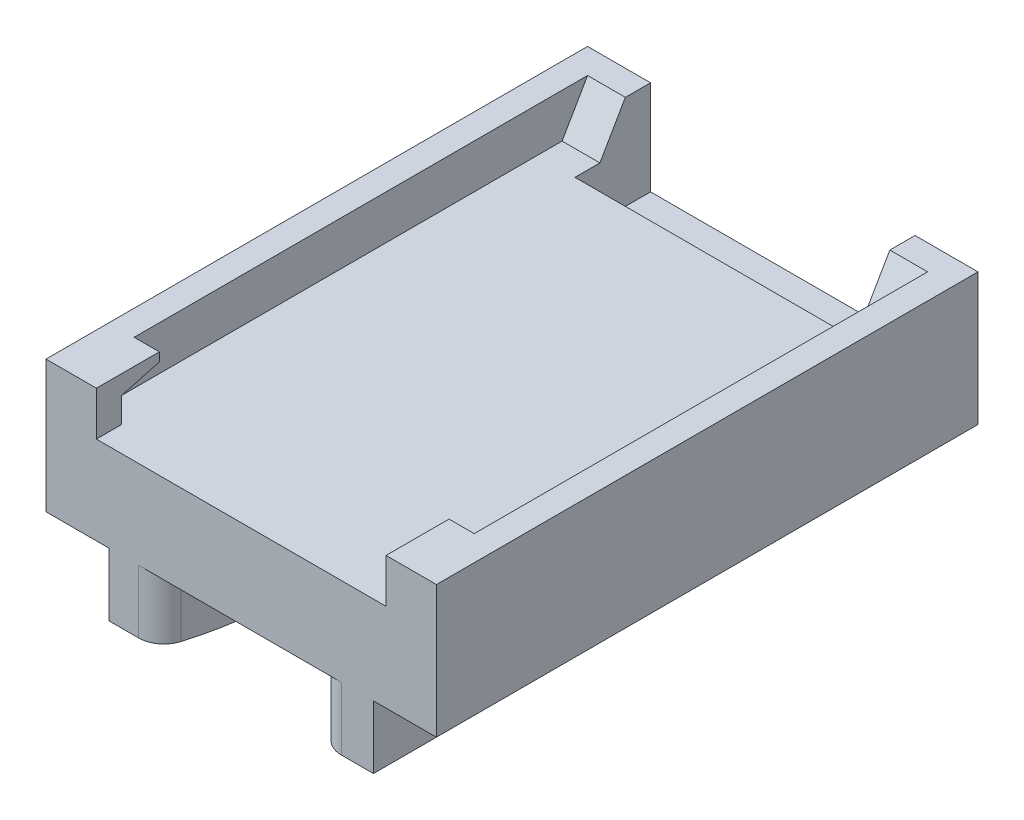
ISO-10303-21;
HEADER;
FILE_DESCRIPTION(('STEP AP214'),'2;1');
FILE_NAME('part.step','',(''),(''),'','','');
FILE_SCHEMA(('AUTOMOTIVE_DESIGN { 1 0 10303 214 1 1 1 1 }'));
ENDSEC;
DATA;
#1=APPLICATION_CONTEXT('core data for automotive mechanical design processes');
#2=APPLICATION_PROTOCOL_DEFINITION('international standard','automotive_design',2000,#1);
#3=PRODUCT_CONTEXT('',#1,'mechanical');
#4=PRODUCT('Part','Part','',(#3));
#5=PRODUCT_RELATED_PRODUCT_CATEGORY('part','',(#4));
#6=PRODUCT_DEFINITION_FORMATION('','',#4);
#7=PRODUCT_DEFINITION_CONTEXT('part definition',#1,'design');
#8=PRODUCT_DEFINITION('design','',#6,#7);
#9=PRODUCT_DEFINITION_SHAPE('','',#8);
#10=(LENGTH_UNIT() NAMED_UNIT(*) SI_UNIT(.MILLI.,.METRE.));
#11=(NAMED_UNIT(*) PLANE_ANGLE_UNIT() SI_UNIT($,.RADIAN.));
#12=(NAMED_UNIT(*) SI_UNIT($,.STERADIAN.) SOLID_ANGLE_UNIT());
#13=UNCERTAINTY_MEASURE_WITH_UNIT(LENGTH_MEASURE(1.E-05),#10,'distance_accuracy_value','');
#14=(GEOMETRIC_REPRESENTATION_CONTEXT(3) GLOBAL_UNCERTAINTY_ASSIGNED_CONTEXT((#13)) GLOBAL_UNIT_ASSIGNED_CONTEXT((#10,
#11,#12)) REPRESENTATION_CONTEXT('',''));
#15=CARTESIAN_POINT('',(0.,0.,0.));
#16=DIRECTION('',(0.,0.,1.));
#17=DIRECTION('',(1.,0.,0.));
#18=AXIS2_PLACEMENT_3D('',#15,#16,#17);
#19=CARTESIAN_POINT('',(13.5,15.5,19.5));
#20=DIRECTION('',(1.,0.,0.));
#21=DIRECTION('',(0.,0.,-1.));
#22=AXIS2_PLACEMENT_3D('',#19,#20,#21);
#23=PLANE('',#22);
#24=DIRECTION('',(0.,-1.,0.));
#25=VECTOR('',#24,1.);
#26=CARTESIAN_POINT('',(13.5,15.5,19.5));
#27=LINE('',#26,#25);
#28=CARTESIAN_POINT('',(13.5,14.,19.5));
#29=VERTEX_POINT('',#28);
#30=CARTESIAN_POINT('',(13.5,12.,19.5));
#31=VERTEX_POINT('',#30);
#32=EDGE_CURVE('E383',#29,#31,#27,.T.);
#33=ORIENTED_EDGE('',*,*,#32,.F.);
#34=DIRECTION('',(0.,-0.258819045102518,0.965925826289069));
#35=VECTOR('',#34,1.);
#36=CARTESIAN_POINT('',(13.5,14.1004809471617,19.125));
#37=LINE('',#36,#35);
#38=CARTESIAN_POINT('',(13.5,14.8038475772934,16.5));
#39=VERTEX_POINT('',#38);
#40=EDGE_CURVE('E12',#29,#39,#37,.F.);
#41=ORIENTED_EDGE('',*,*,#40,.T.);
#42=DIRECTION('',(0.,-1.,0.));
#43=VECTOR('',#42,1.);
#44=CARTESIAN_POINT('',(13.5,15.5,16.5));
#45=LINE('',#44,#43);
#46=CARTESIAN_POINT('',(13.5,15.5,16.5));
#47=VERTEX_POINT('',#46);
#48=EDGE_CURVE('E293',#47,#39,#45,.T.);
#49=ORIENTED_EDGE('',*,*,#48,.F.);
#50=DIRECTION('',(0.,0.,1.));
#51=VECTOR('',#50,1.);
#52=CARTESIAN_POINT('',(13.5,15.5,19.5));
#53=LINE('',#52,#51);
#54=CARTESIAN_POINT('',(13.5,15.5,-19.5));
#55=VERTEX_POINT('',#54);
#56=EDGE_CURVE('E286',#55,#47,#53,.T.);
#57=ORIENTED_EDGE('',*,*,#56,.F.);
#58=DIRECTION('',(0.,0.866025403784437,-0.500000000000002));
#59=VECTOR('',#58,1.);
#60=CARTESIAN_POINT('',(13.5,15.5,-19.5));
#61=LINE('',#60,#59);
#62=CARTESIAN_POINT('',(13.5,12.,-17.4792740578363));
#63=VERTEX_POINT('',#62);
#64=EDGE_CURVE('E495',#55,#63,#61,.F.);
#65=ORIENTED_EDGE('',*,*,#64,.T.);
#66=DIRECTION('',(0.,0.,1.));
#67=VECTOR('',#66,1.);
#68=CARTESIAN_POINT('',(13.5,12.,19.5));
#69=LINE('',#68,#67);
#70=EDGE_CURVE('E361',#63,#31,#69,.T.);
#71=ORIENTED_EDGE('',*,*,#70,.T.);
#72=EDGE_LOOP('',(#33,#41,#49,#57,#65,#71));
#73=FACE_BOUND('',#72,.T.);
#74=ADVANCED_FACE('F39',(#73),#23,.F.);
#75=CARTESIAN_POINT('',(11.5,15.5,19.5));
#76=DIRECTION('',(0.,0.,1.));
#77=DIRECTION('',(1.,0.,0.));
#78=AXIS2_PLACEMENT_3D('',#75,#76,#77);
#79=PLANE('',#78);
#80=DIRECTION('',(-1.,0.,0.));
#81=VECTOR('',#80,1.);
#82=CARTESIAN_POINT('',(11.5,14.,19.5));
#83=LINE('',#82,#81);
#84=CARTESIAN_POINT('',(11.5,14.,19.5));
#85=VERTEX_POINT('',#84);
#86=EDGE_CURVE('E274',#29,#85,#83,.T.);
#87=ORIENTED_EDGE('',*,*,#86,.F.);
#88=ORIENTED_EDGE('',*,*,#32,.T.);
#89=DIRECTION('',(-1.,0.,0.));
#90=VECTOR('',#89,1.);
#91=CARTESIAN_POINT('',(11.5,12.,19.5));
#92=LINE('',#91,#90);
#93=CARTESIAN_POINT('',(11.5,12.,19.5));
#94=VERTEX_POINT('',#93);
#95=EDGE_CURVE('E376',#31,#94,#92,.T.);
#96=ORIENTED_EDGE('',*,*,#95,.T.);
#97=DIRECTION('',(0.,-1.,0.));
#98=VECTOR('',#97,1.);
#99=CARTESIAN_POINT('',(11.5,15.5,19.5));
#100=LINE('',#99,#98);
#101=EDGE_CURVE('E381',#85,#94,#100,.T.);
#102=ORIENTED_EDGE('',*,*,#101,.F.);
#103=EDGE_LOOP('',(#87,#88,#96,#102));
#104=FACE_BOUND('',#103,.T.);
#105=ADVANCED_FACE('F668',(#104),#79,.F.);
#106=CARTESIAN_POINT('',(-13.5,15.5,19.5));
#107=DIRECTION('',(0.,0.,1.));
#108=DIRECTION('',(1.,0.,0.));
#109=AXIS2_PLACEMENT_3D('',#106,#107,#108);
#110=PLANE('',#109);
#111=DIRECTION('',(-1.,0.,0.));
#112=VECTOR('',#111,1.);
#113=CARTESIAN_POINT('',(-11.5,14.,19.5));
#114=LINE('',#113,#112);
#115=CARTESIAN_POINT('',(-11.5,14.,19.5));
#116=VERTEX_POINT('',#115);
#117=CARTESIAN_POINT('',(-13.5,14.,19.5));
#118=VERTEX_POINT('',#117);
#119=EDGE_CURVE('E295',#116,#118,#114,.T.);
#120=ORIENTED_EDGE('',*,*,#119,.F.);
#121=DIRECTION('',(0.,-1.,0.));
#122=VECTOR('',#121,1.);
#123=CARTESIAN_POINT('',(-11.5,15.5,19.5));
#124=LINE('',#123,#122);
#125=CARTESIAN_POINT('',(-11.5,12.,19.5));
#126=VERTEX_POINT('',#125);
#127=EDGE_CURVE('E356',#116,#126,#124,.T.);
#128=ORIENTED_EDGE('',*,*,#127,.T.);
#129=DIRECTION('',(-1.,0.,0.));
#130=VECTOR('',#129,1.);
#131=CARTESIAN_POINT('',(-13.5,12.,19.5));
#132=LINE('',#131,#130);
#133=CARTESIAN_POINT('',(-13.5,12.,19.5));
#134=VERTEX_POINT('',#133);
#135=EDGE_CURVE('E348',#126,#134,#132,.T.);
#136=ORIENTED_EDGE('',*,*,#135,.T.);
#137=DIRECTION('',(0.,-1.,0.));
#138=VECTOR('',#137,1.);
#139=CARTESIAN_POINT('',(-13.5,15.5,19.5));
#140=LINE('',#139,#138);
#141=EDGE_CURVE('E354',#118,#134,#140,.T.);
#142=ORIENTED_EDGE('',*,*,#141,.F.);
#143=EDGE_LOOP('',(#120,#128,#136,#142));
#144=FACE_BOUND('',#143,.T.);
#145=ADVANCED_FACE('F542',(#144),#110,.F.);
#146=CARTESIAN_POINT('',(-13.5,15.5,19.5));
#147=DIRECTION('',(-1.,0.,0.));
#148=DIRECTION('',(0.,0.,1.));
#149=AXIS2_PLACEMENT_3D('',#146,#147,#148);
#150=PLANE('',#149);
#151=DIRECTION('',(0.,1.,0.));
#152=VECTOR('',#151,1.);
#153=CARTESIAN_POINT('',(-13.5,15.5,16.5));
#154=LINE('',#153,#152);
#155=CARTESIAN_POINT('',(-13.5,14.8038475772934,16.5));
#156=VERTEX_POINT('',#155);
#157=CARTESIAN_POINT('',(-13.5,15.5,16.5));
#158=VERTEX_POINT('',#157);
#159=EDGE_CURVE('E302',#156,#158,#154,.T.);
#160=ORIENTED_EDGE('',*,*,#159,.F.);
#161=DIRECTION('',(0.,-0.258819045102518,0.965925826289069));
#162=VECTOR('',#161,1.);
#163=CARTESIAN_POINT('',(-13.5,14.1004809471617,19.125));
#164=LINE('',#163,#162);
#165=EDGE_CURVE('E48',#156,#118,#164,.T.);
#166=ORIENTED_EDGE('',*,*,#165,.T.);
#167=ORIENTED_EDGE('',*,*,#141,.T.);
#168=DIRECTION('',(0.,0.,-1.));
#169=VECTOR('',#168,1.);
#170=CARTESIAN_POINT('',(-13.5,12.,19.5));
#171=LINE('',#170,#169);
#172=CARTESIAN_POINT('',(-13.5,12.,-17.4792740578363));
#173=VERTEX_POINT('',#172);
#174=EDGE_CURVE('E330',#134,#173,#171,.T.);
#175=ORIENTED_EDGE('',*,*,#174,.T.);
#176=DIRECTION('',(0.,-0.866025403784437,0.500000000000002));
#177=VECTOR('',#176,1.);
#178=CARTESIAN_POINT('',(-13.5,15.5,-19.5));
#179=LINE('',#178,#177);
#180=CARTESIAN_POINT('',(-13.5,15.5,-19.5));
#181=VERTEX_POINT('',#180);
#182=EDGE_CURVE('E501',#173,#181,#179,.F.);
#183=ORIENTED_EDGE('',*,*,#182,.T.);
#184=DIRECTION('',(0.,0.,-1.));
#185=VECTOR('',#184,1.);
#186=CARTESIAN_POINT('',(-13.5,15.5,19.5));
#187=LINE('',#186,#185);
#188=EDGE_CURVE('E332',#158,#181,#187,.T.);
#189=ORIENTED_EDGE('',*,*,#188,.F.);
#190=EDGE_LOOP('',(#160,#166,#167,#175,#183,#189));
#191=FACE_BOUND('',#190,.T.);
#192=ADVANCED_FACE('F536',(#191),#150,.F.);
#193=CARTESIAN_POINT('',(0.,12.,0.));
#194=DIRECTION('',(0.,-1.,0.));
#195=DIRECTION('',(0.,0.,-1.));
#196=AXIS2_PLACEMENT_3D('',#193,#194,#195);
#197=PLANE('',#196);
#198=ORIENTED_EDGE('',*,*,#70,.F.);
#199=DIRECTION('',(-1.,0.,0.));
#200=VECTOR('',#199,1.);
#201=CARTESIAN_POINT('',(10.5,12.,-17.4792740578363));
#202=LINE('',#201,#200);
#203=CARTESIAN_POINT('',(10.5,12.,-17.4792740578363));
#204=VERTEX_POINT('',#203);
#205=EDGE_CURVE('E499',#63,#204,#202,.T.);
#206=ORIENTED_EDGE('',*,*,#205,.T.);
#207=DIRECTION('',(0.,0.,-1.));
#208=VECTOR('',#207,1.);
#209=CARTESIAN_POINT('',(10.5,12.,-21.5));
#210=LINE('',#209,#208);
#211=CARTESIAN_POINT('',(10.5,12.,-15.5));
#212=VERTEX_POINT('',#211);
#213=EDGE_CURVE('E314',#212,#204,#210,.T.);
#214=ORIENTED_EDGE('',*,*,#213,.F.);
#215=DIRECTION('',(1.,0.,0.));
#216=VECTOR('',#215,1.);
#217=CARTESIAN_POINT('',(-10.5,12.,-15.5));
#218=LINE('',#217,#216);
#219=CARTESIAN_POINT('',(-10.5,12.,-15.5));
#220=VERTEX_POINT('',#219);
#221=EDGE_CURVE('E321',#220,#212,#218,.T.);
#222=ORIENTED_EDGE('',*,*,#221,.F.);
#223=DIRECTION('',(0.,0.,1.));
#224=VECTOR('',#223,1.);
#225=CARTESIAN_POINT('',(-10.5,12.,-21.5));
#226=LINE('',#225,#224);
#227=CARTESIAN_POINT('',(-10.5,12.,-17.4792740578363));
#228=VERTEX_POINT('',#227);
#229=EDGE_CURVE('E307',#228,#220,#226,.T.);
#230=ORIENTED_EDGE('',*,*,#229,.F.);
#231=DIRECTION('',(-1.,0.,0.));
#232=VECTOR('',#231,1.);
#233=CARTESIAN_POINT('',(-13.5,12.,-17.4792740578363));
#234=LINE('',#233,#232);
#235=EDGE_CURVE('E497',#228,#173,#234,.T.);
#236=ORIENTED_EDGE('',*,*,#235,.T.);
#237=ORIENTED_EDGE('',*,*,#174,.F.);
#238=ORIENTED_EDGE('',*,*,#135,.F.);
#239=DIRECTION('',(0.,0.,-1.));
#240=VECTOR('',#239,1.);
#241=CARTESIAN_POINT('',(-11.5,12.,19.5));
#242=LINE('',#241,#240);
#243=CARTESIAN_POINT('',(-11.5,12.,21.5));
#244=VERTEX_POINT('',#243);
#245=EDGE_CURVE('E319',#244,#126,#242,.T.);
#246=ORIENTED_EDGE('',*,*,#245,.F.);
#247=DIRECTION('',(1.,0.,0.));
#248=VECTOR('',#247,1.);
#249=CARTESIAN_POINT('',(-15.5,12.,21.5));
#250=LINE('',#249,#248);
#251=CARTESIAN_POINT('',(11.5,12.,21.5));
#252=VERTEX_POINT('',#251);
#253=EDGE_CURVE('E462',#244,#252,#250,.T.);
#254=ORIENTED_EDGE('',*,*,#253,.T.);
#255=DIRECTION('',(0.,0.,1.));
#256=VECTOR('',#255,1.);
#257=CARTESIAN_POINT('',(11.5,12.,19.5));
#258=LINE('',#257,#256);
#259=EDGE_CURVE('E365',#94,#252,#258,.T.);
#260=ORIENTED_EDGE('',*,*,#259,.F.);
#261=ORIENTED_EDGE('',*,*,#95,.F.);
#262=EDGE_LOOP('',(#198,#206,#214,#222,#230,#236,#237,#238,#246,#254,#260,#261));
#263=FACE_BOUND('',#262,.T.);
#264=ADVANCED_FACE('F580',(#263),#197,.F.);
#265=CARTESIAN_POINT('',(15.5,12.,21.5));
#266=DIRECTION('',(-1.,0.,0.));
#267=DIRECTION('',(0.,0.,1.));
#268=AXIS2_PLACEMENT_3D('',#265,#266,#267);
#269=PLANE('',#268);
#270=DIRECTION('',(0.,0.,-1.));
#271=VECTOR('',#270,1.);
#272=CARTESIAN_POINT('',(15.5,5.,21.5));
#273=LINE('',#272,#271);
#274=CARTESIAN_POINT('',(15.5,5.,21.5));
#275=VERTEX_POINT('',#274);
#276=CARTESIAN_POINT('',(15.5,5.,-21.5));
#277=VERTEX_POINT('',#276);
#278=EDGE_CURVE('E392',#275,#277,#273,.T.);
#279=ORIENTED_EDGE('',*,*,#278,.T.);
#280=DIRECTION('',(0.,-1.,0.));
#281=VECTOR('',#280,1.);
#282=CARTESIAN_POINT('',(15.5,12.,-21.5));
#283=LINE('',#282,#281);
#284=CARTESIAN_POINT('',(15.5,15.5,-21.5));
#285=VERTEX_POINT('',#284);
#286=EDGE_CURVE('E479',#285,#277,#283,.T.);
#287=ORIENTED_EDGE('',*,*,#286,.F.);
#288=DIRECTION('',(0.,0.,-1.));
#289=VECTOR('',#288,1.);
#290=CARTESIAN_POINT('',(15.5,15.5,-21.5));
#291=LINE('',#290,#289);
#292=CARTESIAN_POINT('',(15.5,15.5,21.5));
#293=VERTEX_POINT('',#292);
#294=EDGE_CURVE('E362',#293,#285,#291,.T.);
#295=ORIENTED_EDGE('',*,*,#294,.F.);
#296=DIRECTION('',(0.,-1.,0.));
#297=VECTOR('',#296,1.);
#298=CARTESIAN_POINT('',(15.5,12.,21.5));
#299=LINE('',#298,#297);
#300=EDGE_CURVE('E464',#293,#275,#299,.T.);
#301=ORIENTED_EDGE('',*,*,#300,.T.);
#302=EDGE_LOOP('',(#279,#287,#295,#301));
#303=FACE_BOUND('',#302,.T.);
#304=ADVANCED_FACE('F604',(#303),#269,.F.);
#305=CARTESIAN_POINT('',(-15.5,12.,21.5));
#306=DIRECTION('',(1.,0.,0.));
#307=DIRECTION('',(0.,0.,-1.));
#308=AXIS2_PLACEMENT_3D('',#305,#306,#307);
#309=PLANE('',#308);
#310=DIRECTION('',(0.,0.,1.));
#311=VECTOR('',#310,1.);
#312=CARTESIAN_POINT('',(-15.5,5.,21.5));
#313=LINE('',#312,#311);
#314=CARTESIAN_POINT('',(-15.5,5.,-21.5));
#315=VERTEX_POINT('',#314);
#316=CARTESIAN_POINT('',(-15.5,5.,21.5));
#317=VERTEX_POINT('',#316);
#318=EDGE_CURVE('E416',#315,#317,#313,.T.);
#319=ORIENTED_EDGE('',*,*,#318,.T.);
#320=DIRECTION('',(0.,-1.,0.));
#321=VECTOR('',#320,1.);
#322=CARTESIAN_POINT('',(-15.5,12.,21.5));
#323=LINE('',#322,#321);
#324=CARTESIAN_POINT('',(-15.5,15.5,21.5));
#325=VERTEX_POINT('',#324);
#326=EDGE_CURVE('E473',#325,#317,#323,.T.);
#327=ORIENTED_EDGE('',*,*,#326,.F.);
#328=DIRECTION('',(0.,0.,1.));
#329=VECTOR('',#328,1.);
#330=CARTESIAN_POINT('',(-15.5,15.5,-21.5));
#331=LINE('',#330,#329);
#332=CARTESIAN_POINT('',(-15.5,15.5,-21.5));
#333=VERTEX_POINT('',#332);
#334=EDGE_CURVE('E342',#333,#325,#331,.T.);
#335=ORIENTED_EDGE('',*,*,#334,.F.);
#336=DIRECTION('',(0.,-1.,0.));
#337=VECTOR('',#336,1.);
#338=CARTESIAN_POINT('',(-15.5,12.,-21.5));
#339=LINE('',#338,#337);
#340=EDGE_CURVE('E476',#333,#315,#339,.T.);
#341=ORIENTED_EDGE('',*,*,#340,.T.);
#342=EDGE_LOOP('',(#319,#327,#335,#341));
#343=FACE_BOUND('',#342,.T.);
#344=ADVANCED_FACE('F573',(#343),#309,.F.);
#345=CARTESIAN_POINT('',(0.,0.,0.));
#346=DIRECTION('',(0.,-1.,0.));
#347=DIRECTION('',(0.,0.,-1.));
#348=AXIS2_PLACEMENT_3D('',#345,#346,#347);
#349=PLANE('',#348);
#350=DIRECTION('',(1.,0.,0.));
#351=VECTOR('',#350,1.);
#352=CARTESIAN_POINT('',(-15.5,0.,21.5));
#353=LINE('',#352,#351);
#354=CARTESIAN_POINT('',(7.95538573059348,0.,21.5));
#355=VERTEX_POINT('',#354);
#356=CARTESIAN_POINT('',(10.5,0.,21.5));
#357=VERTEX_POINT('',#356);
#358=EDGE_CURVE('E468',#355,#357,#353,.T.);
#359=ORIENTED_EDGE('',*,*,#358,.F.);
#360=CARTESIAN_POINT('',(7.95538573059348,0.,19.5));
#361=DIRECTION('',(0.,-1.,0.));
#362=DIRECTION('',(0.,0.,-1.));
#363=AXIS2_PLACEMENT_3D('',#360,#361,#362);
#364=CIRCLE('',#363,2.);
#365=CARTESIAN_POINT('',(6.11673869605796,0.,20.2870051349221));
#366=VERTEX_POINT('',#365);
#367=EDGE_CURVE('E514',#355,#366,#364,.T.);
#368=ORIENTED_EDGE('',*,*,#367,.T.);
#369=CARTESIAN_POINT('',(47.6073314525383,0.,2.52758261554708));
#370=DIRECTION('',(0.,1.,0.));
#371=DIRECTION('',(0.,0.,-1.));
#372=AXIS2_PLACEMENT_3D('',#369,#370,#371);
#373=CIRCLE('',#372,45.1316560244113);
#374=CARTESIAN_POINT('',(5.82861770933202,0.,19.5981846397584));
#375=VERTEX_POINT('',#374);
#376=EDGE_CURVE('E442',#375,#366,#373,.T.);
#377=ORIENTED_EDGE('',*,*,#376,.F.);
#378=CARTESIAN_POINT('',(31.016679316548,0.,11.4213544929199));
#379=DIRECTION('',(0.,1.,0.));
#380=DIRECTION('',(0.,0.,-1.));
#381=AXIS2_PLACEMENT_3D('',#378,#379,#380);
#382=CIRCLE('',#381,26.4820505017862);
#383=CARTESIAN_POINT('',(4.55352122446592,0.,10.4212232152242));
#384=VERTEX_POINT('',#383);
#385=EDGE_CURVE('E439',#384,#375,#382,.T.);
#386=ORIENTED_EDGE('',*,*,#385,.F.);
#387=DIRECTION('',(-0.037766383597384,0.,0.999286595662113));
#388=VECTOR('',#387,1.);
#389=CARTESIAN_POINT('',(4.94031767596257,0.,0.186711132975535));
#390=LINE('',#389,#388);
#391=CARTESIAN_POINT('',(5.75993104330783,0.,-21.5));
#392=VERTEX_POINT('',#391);
#393=EDGE_CURVE('E484',#392,#384,#390,.T.);
#394=ORIENTED_EDGE('',*,*,#393,.F.);
#395=DIRECTION('',(-1.,0.,0.));
#396=VECTOR('',#395,1.);
#397=CARTESIAN_POINT('',(-15.5,0.,-21.5));
#398=LINE('',#397,#396);
#399=CARTESIAN_POINT('',(10.5,0.,-21.5));
#400=VERTEX_POINT('',#399);
#401=EDGE_CURVE('E466',#400,#392,#398,.T.);
#402=ORIENTED_EDGE('',*,*,#401,.F.);
#403=DIRECTION('',(0.,0.,-1.));
#404=VECTOR('',#403,1.);
#405=CARTESIAN_POINT('',(10.5,0.,-21.5));
#406=LINE('',#405,#404);
#407=EDGE_CURVE('E400',#357,#400,#406,.T.);
#408=ORIENTED_EDGE('',*,*,#407,.F.);
#409=EDGE_LOOP('',(#359,#368,#377,#386,#394,#402,#408));
#410=FACE_BOUND('',#409,.T.);
#411=ADVANCED_FACE('F616',(#410),#349,.T.);
#412=CARTESIAN_POINT('',(-15.5,12.,-21.5));
#413=DIRECTION('',(0.,0.,1.));
#414=DIRECTION('',(1.,0.,0.));
#415=AXIS2_PLACEMENT_3D('',#412,#413,#414);
#416=PLANE('',#415);
#417=DIRECTION('',(0.,-1.,0.));
#418=VECTOR('',#417,1.);
#419=CARTESIAN_POINT('',(-10.5,15.5,-21.5));
#420=LINE('',#419,#418);
#421=CARTESIAN_POINT('',(-10.5,15.5,-21.5));
#422=VERTEX_POINT('',#421);
#423=CARTESIAN_POINT('',(-10.5,8.,-21.5));
#424=VERTEX_POINT('',#423);
#425=EDGE_CURVE('E345',#422,#424,#420,.T.);
#426=ORIENTED_EDGE('',*,*,#425,.T.);
#427=DIRECTION('',(-1.,0.,0.));
#428=VECTOR('',#427,1.);
#429=CARTESIAN_POINT('',(-10.5,8.,-21.5));
#430=LINE('',#429,#428);
#431=CARTESIAN_POINT('',(10.5,8.,-21.5));
#432=VERTEX_POINT('',#431);
#433=EDGE_CURVE('E316',#432,#424,#430,.T.);
#434=ORIENTED_EDGE('',*,*,#433,.F.);
#435=DIRECTION('',(0.,-1.,0.));
#436=VECTOR('',#435,1.);
#437=CARTESIAN_POINT('',(10.5,15.5,-21.5));
#438=LINE('',#437,#436);
#439=CARTESIAN_POINT('',(10.5,15.5,-21.5));
#440=VERTEX_POINT('',#439);
#441=EDGE_CURVE('E385',#440,#432,#438,.T.);
#442=ORIENTED_EDGE('',*,*,#441,.F.);
#443=DIRECTION('',(-1.,0.,0.));
#444=VECTOR('',#443,1.);
#445=CARTESIAN_POINT('',(15.5,15.5,-21.5));
#446=LINE('',#445,#444);
#447=EDGE_CURVE('E364',#285,#440,#446,.T.);
#448=ORIENTED_EDGE('',*,*,#447,.F.);
#449=ORIENTED_EDGE('',*,*,#286,.T.);
#450=DIRECTION('',(-1.,0.,0.));
#451=VECTOR('',#450,1.);
#452=CARTESIAN_POINT('',(15.5,5.,-21.5));
#453=LINE('',#452,#451);
#454=CARTESIAN_POINT('',(10.5,5.,-21.5));
#455=VERTEX_POINT('',#454);
#456=EDGE_CURVE('E389',#277,#455,#453,.T.);
#457=ORIENTED_EDGE('',*,*,#456,.T.);
#458=DIRECTION('',(0.,-1.,0.));
#459=VECTOR('',#458,1.);
#460=CARTESIAN_POINT('',(10.5,48.2897216438267,-21.5));
#461=LINE('',#460,#459);
#462=EDGE_CURVE('E393',#455,#400,#461,.T.);
#463=ORIENTED_EDGE('',*,*,#462,.T.);
#464=ORIENTED_EDGE('',*,*,#401,.T.);
#465=DIRECTION('',(0.,1.,0.));
#466=VECTOR('',#465,1.);
#467=CARTESIAN_POINT('',(5.75993104330783,12.,-21.5));
#468=LINE('',#467,#466);
#469=CARTESIAN_POINT('',(5.75993104330783,5.,-21.5));
#470=VERTEX_POINT('',#469);
#471=EDGE_CURVE('E456',#392,#470,#468,.T.);
#472=ORIENTED_EDGE('',*,*,#471,.T.);
#473=DIRECTION('',(1.,0.,0.));
#474=VECTOR('',#473,1.);
#475=CARTESIAN_POINT('',(-15.5,5.,-21.5));
#476=LINE('',#475,#474);
#477=CARTESIAN_POINT('',(-5.56477616823584,5.,-21.5));
#478=VERTEX_POINT('',#477);
#479=EDGE_CURVE('E459',#478,#470,#476,.T.);
#480=ORIENTED_EDGE('',*,*,#479,.F.);
#481=DIRECTION('',(0.,-1.,0.));
#482=VECTOR('',#481,1.);
#483=CARTESIAN_POINT('',(-5.56477616823584,12.,-21.5));
#484=LINE('',#483,#482);
#485=CARTESIAN_POINT('',(-5.56477616823584,0.,-21.5));
#486=VERTEX_POINT('',#485);
#487=EDGE_CURVE('E453',#478,#486,#484,.T.);
#488=ORIENTED_EDGE('',*,*,#487,.T.);
#489=CARTESIAN_POINT('',(-10.5,0.,-21.5));
#490=VERTEX_POINT('',#489);
#491=EDGE_CURVE('E461',#486,#490,#398,.T.);
#492=ORIENTED_EDGE('',*,*,#491,.T.);
#493=DIRECTION('',(0.,-1.,0.));
#494=VECTOR('',#493,1.);
#495=CARTESIAN_POINT('',(-10.5,48.2897216438267,-21.5));
#496=LINE('',#495,#494);
#497=CARTESIAN_POINT('',(-10.5,5.,-21.5));
#498=VERTEX_POINT('',#497);
#499=EDGE_CURVE('E420',#498,#490,#496,.T.);
#500=ORIENTED_EDGE('',*,*,#499,.F.);
#501=DIRECTION('',(-1.,0.,0.));
#502=VECTOR('',#501,1.);
#503=CARTESIAN_POINT('',(-15.5,5.,-21.5));
#504=LINE('',#503,#502);
#505=EDGE_CURVE('E403',#498,#315,#504,.T.);
#506=ORIENTED_EDGE('',*,*,#505,.T.);
#507=ORIENTED_EDGE('',*,*,#340,.F.);
#508=DIRECTION('',(-1.,0.,0.));
#509=VECTOR('',#508,1.);
#510=CARTESIAN_POINT('',(-10.5,15.5,-21.5));
#511=LINE('',#510,#509);
#512=EDGE_CURVE('E339',#422,#333,#511,.T.);
#513=ORIENTED_EDGE('',*,*,#512,.F.);
#514=EDGE_LOOP('',(#426,#434,#442,#448,#449,#457,#463,#464,#472,#480,#488,#492,#500,#506,#507,#513));
#515=FACE_BOUND('',#514,.T.);
#516=ADVANCED_FACE('F569',(#515),#416,.F.);
#517=CARTESIAN_POINT('',(-15.5,12.,21.5));
#518=DIRECTION('',(0.,0.,-1.));
#519=DIRECTION('',(-1.,0.,0.));
#520=AXIS2_PLACEMENT_3D('',#517,#518,#519);
#521=PLANE('',#520);
#522=DIRECTION('',(-1.,0.,0.));
#523=VECTOR('',#522,1.);
#524=CARTESIAN_POINT('',(-15.5,5.,21.5));
#525=LINE('',#524,#523);
#526=CARTESIAN_POINT('',(7.95538573059348,5.,21.5));
#527=VERTEX_POINT('',#526);
#528=CARTESIAN_POINT('',(-8.13622078540729,5.,21.5));
#529=VERTEX_POINT('',#528);
#530=EDGE_CURVE('E486',#527,#529,#525,.T.);
#531=ORIENTED_EDGE('',*,*,#530,.F.);
#532=DIRECTION('',(0.,-1.,0.));
#533=VECTOR('',#532,1.);
#534=CARTESIAN_POINT('',(7.95538573059348,12.,21.5));
#535=LINE('',#534,#533);
#536=EDGE_CURVE('E511',#527,#355,#535,.T.);
#537=ORIENTED_EDGE('',*,*,#536,.T.);
#538=ORIENTED_EDGE('',*,*,#358,.T.);
#539=DIRECTION('',(0.,-1.,0.));
#540=VECTOR('',#539,1.);
#541=CARTESIAN_POINT('',(10.5,48.2897216438267,21.5));
#542=LINE('',#541,#540);
#543=CARTESIAN_POINT('',(10.5,5.,21.5));
#544=VERTEX_POINT('',#543);
#545=EDGE_CURVE('E402',#544,#357,#542,.T.);
#546=ORIENTED_EDGE('',*,*,#545,.F.);
#547=DIRECTION('',(1.,0.,0.));
#548=VECTOR('',#547,1.);
#549=CARTESIAN_POINT('',(10.5,5.,21.5));
#550=LINE('',#549,#548);
#551=EDGE_CURVE('E396',#544,#275,#550,.T.);
#552=ORIENTED_EDGE('',*,*,#551,.T.);
#553=ORIENTED_EDGE('',*,*,#300,.F.);
#554=DIRECTION('',(1.,0.,0.));
#555=VECTOR('',#554,1.);
#556=CARTESIAN_POINT('',(15.5,15.5,21.5));
#557=LINE('',#556,#555);
#558=CARTESIAN_POINT('',(11.5,15.5,21.5));
#559=VERTEX_POINT('',#558);
#560=EDGE_CURVE('E285',#559,#293,#557,.T.);
#561=ORIENTED_EDGE('',*,*,#560,.F.);
#562=DIRECTION('',(0.,-1.,0.));
#563=VECTOR('',#562,1.);
#564=CARTESIAN_POINT('',(11.5,15.5,21.5));
#565=LINE('',#564,#563);
#566=EDGE_CURVE('E281',#559,#252,#565,.T.);
#567=ORIENTED_EDGE('',*,*,#566,.T.);
#568=ORIENTED_EDGE('',*,*,#253,.F.);
#569=DIRECTION('',(0.,-1.,0.));
#570=VECTOR('',#569,1.);
#571=CARTESIAN_POINT('',(-11.5,15.5,21.5));
#572=LINE('',#571,#570);
#573=CARTESIAN_POINT('',(-11.5,15.5,21.5));
#574=VERTEX_POINT('',#573);
#575=EDGE_CURVE('E358',#574,#244,#572,.T.);
#576=ORIENTED_EDGE('',*,*,#575,.F.);
#577=DIRECTION('',(1.,0.,0.));
#578=VECTOR('',#577,1.);
#579=CARTESIAN_POINT('',(-11.5,15.5,21.5));
#580=LINE('',#579,#578);
#581=EDGE_CURVE('E326',#325,#574,#580,.T.);
#582=ORIENTED_EDGE('',*,*,#581,.F.);
#583=ORIENTED_EDGE('',*,*,#326,.T.);
#584=DIRECTION('',(1.,0.,0.));
#585=VECTOR('',#584,1.);
#586=CARTESIAN_POINT('',(-10.5,5.,21.5));
#587=LINE('',#586,#585);
#588=CARTESIAN_POINT('',(-10.5,5.,21.5));
#589=VERTEX_POINT('',#588);
#590=EDGE_CURVE('E412',#317,#589,#587,.T.);
#591=ORIENTED_EDGE('',*,*,#590,.T.);
#592=DIRECTION('',(0.,-1.,0.));
#593=VECTOR('',#592,1.);
#594=CARTESIAN_POINT('',(-10.5,48.2897216438267,21.5));
#595=LINE('',#594,#593);
#596=CARTESIAN_POINT('',(-10.5,0.,21.5));
#597=VERTEX_POINT('',#596);
#598=EDGE_CURVE('E413',#589,#597,#595,.T.);
#599=ORIENTED_EDGE('',*,*,#598,.T.);
#600=CARTESIAN_POINT('',(-8.13622078540729,0.,21.5));
#601=VERTEX_POINT('',#600);
#602=EDGE_CURVE('E465',#597,#601,#353,.T.);
#603=ORIENTED_EDGE('',*,*,#602,.T.);
#604=DIRECTION('',(0.,-1.,0.));
#605=VECTOR('',#604,1.);
#606=CARTESIAN_POINT('',(-8.13622078540729,12.,21.5));
#607=LINE('',#606,#605);
#608=EDGE_CURVE('E508',#601,#529,#607,.F.);
#609=ORIENTED_EDGE('',*,*,#608,.T.);
#610=EDGE_LOOP('',(#531,#537,#538,#546,#552,#553,#561,#567,#568,#576,#582,#583,#591,#599,#603,#609));
#611=FACE_BOUND('',#610,.T.);
#612=ADVANCED_FACE('F575',(#611),#521,.F.);
#613=CARTESIAN_POINT('',(-31.5170365180208,0.,12.5216254644479));
#614=DIRECTION('',(0.,-1.,0.));
#615=DIRECTION('',(0.,0.,-1.));
#616=AXIS2_PLACEMENT_3D('',#613,#614,#615);
#617=CIRCLE('',#616,26.4000052352632);
#618=CARTESIAN_POINT('',(-6.21976089065094,0.,20.0719977900223));
#619=VERTEX_POINT('',#618);
#620=CARTESIAN_POINT('',(-5.1193408865868,0.,12.1724238434694));
#621=VERTEX_POINT('',#620);
#622=EDGE_CURVE('E482',#619,#621,#617,.F.);
#623=ORIENTED_EDGE('',*,*,#622,.F.);
#624=CARTESIAN_POINT('',(-8.13622078540729,0.,19.5));
#625=DIRECTION('',(0.,-1.,0.));
#626=DIRECTION('',(0.,0.,-1.));
#627=AXIS2_PLACEMENT_3D('',#624,#625,#626);
#628=CIRCLE('',#627,2.);
#629=EDGE_CURVE('E520',#619,#601,#628,.T.);
#630=ORIENTED_EDGE('',*,*,#629,.T.);
#631=ORIENTED_EDGE('',*,*,#602,.F.);
#632=DIRECTION('',(0.,0.,1.));
#633=VECTOR('',#632,1.);
#634=CARTESIAN_POINT('',(-10.5,0.,-21.5));
#635=LINE('',#634,#633);
#636=EDGE_CURVE('E388',#490,#597,#635,.T.);
#637=ORIENTED_EDGE('',*,*,#636,.F.);
#638=ORIENTED_EDGE('',*,*,#491,.F.);
#639=DIRECTION('',(-0.0132273315049881,0.,-0.999912515023818));
#640=VECTOR('',#639,1.);
#641=CARTESIAN_POINT('',(-6.0512006918875,0.,-58.2709820102697));
#642=LINE('',#641,#640);
#643=EDGE_CURVE('E409',#621,#486,#642,.T.);
#644=ORIENTED_EDGE('',*,*,#643,.F.);
#645=EDGE_LOOP('',(#623,#630,#631,#637,#638,#644));
#646=FACE_BOUND('',#645,.T.);
#647=ADVANCED_FACE('F640',(#646),#349,.T.);
#648=CARTESIAN_POINT('',(0.,5.,0.));
#649=DIRECTION('',(0.,-1.,0.));
#650=DIRECTION('',(0.,0.,-1.));
#651=AXIS2_PLACEMENT_3D('',#648,#649,#650);
#652=PLANE('',#651);
#653=ORIENTED_EDGE('',*,*,#479,.T.);
#654=DIRECTION('',(0.037766383597384,0.,-0.999286595662113));
#655=VECTOR('',#654,1.);
#656=CARTESIAN_POINT('',(4.55352122446592,5.,10.4212232152242));
#657=LINE('',#656,#655);
#658=CARTESIAN_POINT('',(4.55352122446592,5.,10.4212232152242));
#659=VERTEX_POINT('',#658);
#660=EDGE_CURVE('E426',#659,#470,#657,.T.);
#661=ORIENTED_EDGE('',*,*,#660,.F.);
#662=CARTESIAN_POINT('',(31.016679316548,5.,11.4213544929199));
#663=DIRECTION('',(0.,-1.,0.));
#664=DIRECTION('',(0.,0.,-1.));
#665=AXIS2_PLACEMENT_3D('',#662,#663,#664);
#666=CIRCLE('',#665,26.4820505017862);
#667=CARTESIAN_POINT('',(5.82861770933202,5.,19.5981846397584));
#668=VERTEX_POINT('',#667);
#669=EDGE_CURVE('E429',#668,#659,#666,.T.);
#670=ORIENTED_EDGE('',*,*,#669,.F.);
#671=CARTESIAN_POINT('',(47.6073314525383,5.,2.52758261554708));
#672=DIRECTION('',(0.,-1.,0.));
#673=DIRECTION('',(0.,0.,-1.));
#674=AXIS2_PLACEMENT_3D('',#671,#672,#673);
#675=CIRCLE('',#674,45.1316560244113);
#676=CARTESIAN_POINT('',(6.11673869605796,5.,20.2870051349221));
#677=VERTEX_POINT('',#676);
#678=EDGE_CURVE('E432',#677,#668,#675,.T.);
#679=ORIENTED_EDGE('',*,*,#678,.F.);
#680=CARTESIAN_POINT('',(7.95538573059348,5.,19.5));
#681=DIRECTION('',(0.,-1.,0.));
#682=DIRECTION('',(0.,0.,-1.));
#683=AXIS2_PLACEMENT_3D('',#680,#681,#682);
#684=CIRCLE('',#683,2.);
#685=EDGE_CURVE('E522',#677,#527,#684,.F.);
#686=ORIENTED_EDGE('',*,*,#685,.T.);
#687=ORIENTED_EDGE('',*,*,#530,.T.);
#688=CARTESIAN_POINT('',(-8.13622078540729,5.,19.5));
#689=DIRECTION('',(0.,-1.,0.));
#690=DIRECTION('',(0.,0.,-1.));
#691=AXIS2_PLACEMENT_3D('',#688,#689,#690);
#692=CIRCLE('',#691,2.);
#693=CARTESIAN_POINT('',(-6.21976089065094,5.,20.0719977900223));
#694=VERTEX_POINT('',#693);
#695=EDGE_CURVE('E525',#529,#694,#692,.F.);
#696=ORIENTED_EDGE('',*,*,#695,.T.);
#697=CARTESIAN_POINT('',(-31.5170365180208,5.,12.5216254644479));
#698=DIRECTION('',(0.,-1.,0.));
#699=DIRECTION('',(0.,0.,-1.));
#700=AXIS2_PLACEMENT_3D('',#697,#698,#699);
#701=CIRCLE('',#700,26.4000052352632);
#702=CARTESIAN_POINT('',(-5.1193408865868,5.,12.1724238434694));
#703=VERTEX_POINT('',#702);
#704=EDGE_CURVE('E434',#703,#694,#701,.T.);
#705=ORIENTED_EDGE('',*,*,#704,.F.);
#706=DIRECTION('',(0.0132273315049881,0.,0.999912515023818));
#707=VECTOR('',#706,1.);
#708=CARTESIAN_POINT('',(-6.0512006918875,5.,-58.2709820102697));
#709=LINE('',#708,#707);
#710=EDGE_CURVE('E437',#478,#703,#709,.T.);
#711=ORIENTED_EDGE('',*,*,#710,.F.);
#712=EDGE_LOOP('',(#653,#661,#670,#679,#686,#687,#696,#705,#711));
#713=FACE_BOUND('',#712,.T.);
#714=ADVANCED_FACE('F627',(#713),#652,.T.);
#715=CARTESIAN_POINT('',(-31.5170365180208,148.366967531831,12.5216254644479));
#716=DIRECTION('',(0.,-1.,0.));
#717=DIRECTION('',(0.,0.,-1.));
#718=AXIS2_PLACEMENT_3D('',#715,#716,#717);
#719=CYLINDRICAL_SURFACE('',#718,26.4000052352632);
#720=ORIENTED_EDGE('',*,*,#704,.T.);
#721=DIRECTION('',(0.,-1.,0.));
#722=VECTOR('',#721,1.);
#723=CARTESIAN_POINT('',(-6.21976089065094,148.366967531831,20.0719977900223));
#724=LINE('',#723,#722);
#725=EDGE_CURVE('E518',#694,#619,#724,.T.);
#726=ORIENTED_EDGE('',*,*,#725,.T.);
#727=ORIENTED_EDGE('',*,*,#622,.T.);
#728=DIRECTION('',(0.,-1.,0.));
#729=VECTOR('',#728,1.);
#730=CARTESIAN_POINT('',(-5.1193408865868,148.366967531831,12.1724238434694));
#731=LINE('',#730,#729);
#732=EDGE_CURVE('E445',#703,#621,#731,.T.);
#733=ORIENTED_EDGE('',*,*,#732,.F.);
#734=EDGE_LOOP('',(#720,#726,#727,#733));
#735=FACE_BOUND('',#734,.T.);
#736=ADVANCED_FACE('F653',(#735),#719,.T.);
#737=CARTESIAN_POINT('',(47.6073314525383,148.366967531831,2.52758261554708));
#738=DIRECTION('',(0.,-1.,0.));
#739=DIRECTION('',(0.,0.,-1.));
#740=AXIS2_PLACEMENT_3D('',#737,#738,#739);
#741=CYLINDRICAL_SURFACE('',#740,45.1316560244113);
#742=ORIENTED_EDGE('',*,*,#376,.T.);
#743=DIRECTION('',(0.,-1.,0.));
#744=VECTOR('',#743,1.);
#745=CARTESIAN_POINT('',(6.11673869605796,148.366967531831,20.2870051349221));
#746=LINE('',#745,#744);
#747=EDGE_CURVE('E516',#366,#677,#746,.F.);
#748=ORIENTED_EDGE('',*,*,#747,.T.);
#749=ORIENTED_EDGE('',*,*,#678,.T.);
#750=DIRECTION('',(0.,-1.,0.));
#751=VECTOR('',#750,1.);
#752=CARTESIAN_POINT('',(5.82861770933202,148.366967531831,19.5981846397584));
#753=LINE('',#752,#751);
#754=EDGE_CURVE('E430',#668,#375,#753,.T.);
#755=ORIENTED_EDGE('',*,*,#754,.T.);
#756=EDGE_LOOP('',(#742,#748,#749,#755));
#757=FACE_BOUND('',#756,.T.);
#758=ADVANCED_FACE('F664',(#757),#741,.T.);
#759=CARTESIAN_POINT('',(4.55352122446592,148.366967531831,10.4212232152242));
#760=DIRECTION('',(0.999286595662113,0.,0.037766383597384));
#761=DIRECTION('',(0.037766383597384,0.,-0.999286595662113));
#762=AXIS2_PLACEMENT_3D('',#759,#760,#761);
#763=PLANE('',#762);
#764=ORIENTED_EDGE('',*,*,#393,.T.);
#765=DIRECTION('',(0.,-1.,0.));
#766=VECTOR('',#765,1.);
#767=CARTESIAN_POINT('',(4.55352122446592,148.366967531831,10.4212232152242));
#768=LINE('',#767,#766);
#769=EDGE_CURVE('E447',#659,#384,#768,.T.);
#770=ORIENTED_EDGE('',*,*,#769,.F.);
#771=ORIENTED_EDGE('',*,*,#660,.T.);
#772=ORIENTED_EDGE('',*,*,#471,.F.);
#773=EDGE_LOOP('',(#764,#770,#771,#772));
#774=FACE_BOUND('',#773,.T.);
#775=ADVANCED_FACE('F622',(#774),#763,.F.);
#776=CARTESIAN_POINT('',(-6.0512006918875,148.366967531831,-58.2709820102697));
#777=DIRECTION('',(-0.999912515023818,0.,0.0132273315049881));
#778=DIRECTION('',(0.0132273315049881,0.,0.999912515023818));
#779=AXIS2_PLACEMENT_3D('',#776,#777,#778);
#780=PLANE('',#779);
#781=ORIENTED_EDGE('',*,*,#710,.T.);
#782=ORIENTED_EDGE('',*,*,#732,.T.);
#783=ORIENTED_EDGE('',*,*,#643,.T.);
#784=ORIENTED_EDGE('',*,*,#487,.F.);
#785=EDGE_LOOP('',(#781,#782,#783,#784));
#786=FACE_BOUND('',#785,.T.);
#787=ADVANCED_FACE('F654',(#786),#780,.F.);
#788=CARTESIAN_POINT('',(31.016679316548,148.366967531831,11.4213544929199));
#789=DIRECTION('',(0.,-1.,0.));
#790=DIRECTION('',(0.,0.,-1.));
#791=AXIS2_PLACEMENT_3D('',#788,#789,#790);
#792=CYLINDRICAL_SURFACE('',#791,26.4820505017862);
#793=ORIENTED_EDGE('',*,*,#669,.T.);
#794=ORIENTED_EDGE('',*,*,#769,.T.);
#795=ORIENTED_EDGE('',*,*,#385,.T.);
#796=ORIENTED_EDGE('',*,*,#754,.F.);
#797=EDGE_LOOP('',(#793,#794,#795,#796));
#798=FACE_BOUND('',#797,.T.);
#799=ADVANCED_FACE('F656',(#798),#792,.T.);
#800=CARTESIAN_POINT('',(-10.5,48.2897216438267,-21.5));
#801=DIRECTION('',(1.,0.,0.));
#802=DIRECTION('',(0.,0.,-1.));
#803=AXIS2_PLACEMENT_3D('',#800,#801,#802);
#804=PLANE('',#803);
#805=DIRECTION('',(0.,0.,-1.));
#806=VECTOR('',#805,1.);
#807=CARTESIAN_POINT('',(-10.5,5.,-21.5));
#808=LINE('',#807,#806);
#809=EDGE_CURVE('E410',#589,#498,#808,.T.);
#810=ORIENTED_EDGE('',*,*,#809,.T.);
#811=ORIENTED_EDGE('',*,*,#499,.T.);
#812=ORIENTED_EDGE('',*,*,#636,.T.);
#813=ORIENTED_EDGE('',*,*,#598,.F.);
#814=EDGE_LOOP('',(#810,#811,#812,#813));
#815=FACE_BOUND('',#814,.T.);
#816=ADVANCED_FACE('F644',(#815),#804,.F.);
#817=CARTESIAN_POINT('',(0.,5.,0.));
#818=DIRECTION('',(0.,-1.,0.));
#819=DIRECTION('',(0.,0.,-1.));
#820=AXIS2_PLACEMENT_3D('',#817,#818,#819);
#821=PLANE('',#820);
#822=ORIENTED_EDGE('',*,*,#318,.F.);
#823=ORIENTED_EDGE('',*,*,#505,.F.);
#824=ORIENTED_EDGE('',*,*,#809,.F.);
#825=ORIENTED_EDGE('',*,*,#590,.F.);
#826=EDGE_LOOP('',(#822,#823,#824,#825));
#827=FACE_BOUND('',#826,.T.);
#828=ADVANCED_FACE('F683',(#827),#821,.T.);
#829=CARTESIAN_POINT('',(10.5,48.2897216438267,-21.5));
#830=DIRECTION('',(-1.,0.,0.));
#831=DIRECTION('',(0.,0.,1.));
#832=AXIS2_PLACEMENT_3D('',#829,#830,#831);
#833=PLANE('',#832);
#834=DIRECTION('',(0.,0.,1.));
#835=VECTOR('',#834,1.);
#836=CARTESIAN_POINT('',(10.5,5.,-21.5));
#837=LINE('',#836,#835);
#838=EDGE_CURVE('E399',#455,#544,#837,.T.);
#839=ORIENTED_EDGE('',*,*,#838,.T.);
#840=ORIENTED_EDGE('',*,*,#545,.T.);
#841=ORIENTED_EDGE('',*,*,#407,.T.);
#842=ORIENTED_EDGE('',*,*,#462,.F.);
#843=EDGE_LOOP('',(#839,#840,#841,#842));
#844=FACE_BOUND('',#843,.T.);
#845=ADVANCED_FACE('F613',(#844),#833,.F.);
#846=CARTESIAN_POINT('',(0.,5.,0.));
#847=DIRECTION('',(0.,-1.,0.));
#848=DIRECTION('',(0.,0.,-1.));
#849=AXIS2_PLACEMENT_3D('',#846,#847,#848);
#850=PLANE('',#849);
#851=ORIENTED_EDGE('',*,*,#551,.F.);
#852=ORIENTED_EDGE('',*,*,#838,.F.);
#853=ORIENTED_EDGE('',*,*,#456,.F.);
#854=ORIENTED_EDGE('',*,*,#278,.F.);
#855=EDGE_LOOP('',(#851,#852,#853,#854));
#856=FACE_BOUND('',#855,.T.);
#857=ADVANCED_FACE('F607',(#856),#850,.T.);
#858=CARTESIAN_POINT('',(10.5,15.5,-19.5));
#859=DIRECTION('',(1.,0.,0.));
#860=DIRECTION('',(0.,0.,-1.));
#861=AXIS2_PLACEMENT_3D('',#858,#859,#860);
#862=PLANE('',#861);
#863=DIRECTION('',(0.,0.,-1.));
#864=VECTOR('',#863,1.);
#865=CARTESIAN_POINT('',(10.5,8.,-21.5));
#866=LINE('',#865,#864);
#867=CARTESIAN_POINT('',(10.5,8.,-18.8563985247091));
#868=VERTEX_POINT('',#867);
#869=EDGE_CURVE('E313',#868,#432,#866,.T.);
#870=ORIENTED_EDGE('',*,*,#869,.F.);
#871=DIRECTION('',(0.,0.766044443118975,0.642787609686543));
#872=VECTOR('',#871,1.);
#873=CARTESIAN_POINT('',(10.5,8.,-18.8563985247091));
#874=LINE('',#873,#872);
#875=EDGE_CURVE('E491',#868,#212,#874,.T.);
#876=ORIENTED_EDGE('',*,*,#875,.T.);
#877=ORIENTED_EDGE('',*,*,#213,.T.);
#878=DIRECTION('',(0.,-0.866025403784437,0.500000000000002));
#879=VECTOR('',#878,1.);
#880=CARTESIAN_POINT('',(10.5,15.5,-19.5));
#881=LINE('',#880,#879);
#882=CARTESIAN_POINT('',(10.5,15.5,-19.5));
#883=VERTEX_POINT('',#882);
#884=EDGE_CURVE('E504',#204,#883,#881,.F.);
#885=ORIENTED_EDGE('',*,*,#884,.T.);
#886=DIRECTION('',(0.,0.,1.));
#887=VECTOR('',#886,1.);
#888=CARTESIAN_POINT('',(10.5,15.5,-19.5));
#889=LINE('',#888,#887);
#890=EDGE_CURVE('E367',#440,#883,#889,.T.);
#891=ORIENTED_EDGE('',*,*,#890,.F.);
#892=ORIENTED_EDGE('',*,*,#441,.T.);
#893=EDGE_LOOP('',(#870,#876,#877,#885,#891,#892));
#894=FACE_BOUND('',#893,.T.);
#895=ADVANCED_FACE('F592',(#894),#862,.F.);
#896=CARTESIAN_POINT('',(11.5,15.5,19.5));
#897=DIRECTION('',(1.,0.,0.));
#898=DIRECTION('',(0.,0.,-1.));
#899=AXIS2_PLACEMENT_3D('',#896,#897,#898);
#900=PLANE('',#899);
#901=DIRECTION('',(0.,1.,0.));
#902=VECTOR('',#901,1.);
#903=CARTESIAN_POINT('',(11.5,15.5,16.5));
#904=LINE('',#903,#902);
#905=CARTESIAN_POINT('',(11.5,14.8038475772934,16.5));
#906=VERTEX_POINT('',#905);
#907=CARTESIAN_POINT('',(11.5,15.5,16.5));
#908=VERTEX_POINT('',#907);
#909=EDGE_CURVE('E267',#906,#908,#904,.T.);
#910=ORIENTED_EDGE('',*,*,#909,.F.);
#911=DIRECTION('',(0.,0.258819045102518,-0.965925826289069));
#912=VECTOR('',#911,1.);
#913=CARTESIAN_POINT('',(11.5,14.8038475772934,16.5));
#914=LINE('',#913,#912);
#915=EDGE_CURVE('E61',#906,#85,#914,.F.);
#916=ORIENTED_EDGE('',*,*,#915,.T.);
#917=ORIENTED_EDGE('',*,*,#101,.T.);
#918=ORIENTED_EDGE('',*,*,#259,.T.);
#919=ORIENTED_EDGE('',*,*,#566,.F.);
#920=DIRECTION('',(0.,0.,1.));
#921=VECTOR('',#920,1.);
#922=CARTESIAN_POINT('',(11.5,15.5,19.5));
#923=LINE('',#922,#921);
#924=EDGE_CURVE('E277',#908,#559,#923,.T.);
#925=ORIENTED_EDGE('',*,*,#924,.F.);
#926=EDGE_LOOP('',(#910,#916,#917,#918,#919,#925));
#927=FACE_BOUND('',#926,.T.);
#928=ADVANCED_FACE('F278',(#927),#900,.F.);
#929=CARTESIAN_POINT('',(0.,15.5,0.));
#930=DIRECTION('',(0.,-1.,0.));
#931=DIRECTION('',(0.,0.,-1.));
#932=AXIS2_PLACEMENT_3D('',#929,#930,#931);
#933=PLANE('',#932);
#934=ORIENTED_EDGE('',*,*,#294,.T.);
#935=ORIENTED_EDGE('',*,*,#447,.T.);
#936=ORIENTED_EDGE('',*,*,#890,.T.);
#937=DIRECTION('',(1.,0.,0.));
#938=VECTOR('',#937,1.);
#939=CARTESIAN_POINT('',(10.5,15.5,-19.5));
#940=LINE('',#939,#938);
#941=EDGE_CURVE('E370',#883,#55,#940,.T.);
#942=ORIENTED_EDGE('',*,*,#941,.T.);
#943=ORIENTED_EDGE('',*,*,#56,.T.);
#944=DIRECTION('',(1.,0.,0.));
#945=VECTOR('',#944,1.);
#946=CARTESIAN_POINT('',(11.5,15.5,16.5));
#947=LINE('',#946,#945);
#948=EDGE_CURVE('E271',#908,#47,#947,.T.);
#949=ORIENTED_EDGE('',*,*,#948,.F.);
#950=ORIENTED_EDGE('',*,*,#924,.T.);
#951=ORIENTED_EDGE('',*,*,#560,.T.);
#952=EDGE_LOOP('',(#934,#935,#936,#942,#943,#949,#950,#951));
#953=FACE_BOUND('',#952,.T.);
#954=ADVANCED_FACE('F290',(#953),#933,.F.);
#955=CARTESIAN_POINT('',(-11.5,15.5,19.5));
#956=DIRECTION('',(-1.,0.,0.));
#957=DIRECTION('',(0.,0.,1.));
#958=AXIS2_PLACEMENT_3D('',#955,#956,#957);
#959=PLANE('',#958);
#960=ORIENTED_EDGE('',*,*,#127,.F.);
#961=DIRECTION('',(0.,0.258819045102518,-0.965925826289069));
#962=VECTOR('',#961,1.);
#963=CARTESIAN_POINT('',(-11.5,14.8038475772934,16.5));
#964=LINE('',#963,#962);
#965=CARTESIAN_POINT('',(-11.5,14.8038475772934,16.5));
#966=VERTEX_POINT('',#965);
#967=EDGE_CURVE('E530',#116,#966,#964,.T.);
#968=ORIENTED_EDGE('',*,*,#967,.T.);
#969=DIRECTION('',(0.,-1.,0.));
#970=VECTOR('',#969,1.);
#971=CARTESIAN_POINT('',(-11.5,15.5,16.5));
#972=LINE('',#971,#970);
#973=CARTESIAN_POINT('',(-11.5,15.5,16.5));
#974=VERTEX_POINT('',#973);
#975=EDGE_CURVE('E299',#974,#966,#972,.T.);
#976=ORIENTED_EDGE('',*,*,#975,.F.);
#977=DIRECTION('',(0.,0.,-1.));
#978=VECTOR('',#977,1.);
#979=CARTESIAN_POINT('',(-11.5,15.5,19.5));
#980=LINE('',#979,#978);
#981=EDGE_CURVE('E329',#574,#974,#980,.T.);
#982=ORIENTED_EDGE('',*,*,#981,.F.);
#983=ORIENTED_EDGE('',*,*,#575,.T.);
#984=ORIENTED_EDGE('',*,*,#245,.T.);
#985=EDGE_LOOP('',(#960,#968,#976,#982,#983,#984));
#986=FACE_BOUND('',#985,.T.);
#987=ADVANCED_FACE('F549',(#986),#959,.F.);
#988=CARTESIAN_POINT('',(-10.5,15.5,-19.5));
#989=DIRECTION('',(-1.,0.,0.));
#990=DIRECTION('',(0.,0.,1.));
#991=AXIS2_PLACEMENT_3D('',#988,#989,#990);
#992=PLANE('',#991);
#993=DIRECTION('',(0.,0.,-1.));
#994=VECTOR('',#993,1.);
#995=CARTESIAN_POINT('',(-10.5,15.5,-19.5));
#996=LINE('',#995,#994);
#997=CARTESIAN_POINT('',(-10.5,15.5,-19.5));
#998=VERTEX_POINT('',#997);
#999=EDGE_CURVE('E337',#998,#422,#996,.T.);
#1000=ORIENTED_EDGE('',*,*,#999,.F.);
#1001=DIRECTION('',(0.,0.866025403784437,-0.500000000000002));
#1002=VECTOR('',#1001,1.);
#1003=CARTESIAN_POINT('',(-10.5,15.5,-19.5));
#1004=LINE('',#1003,#1002);
#1005=EDGE_CURVE('E506',#998,#228,#1004,.F.);
#1006=ORIENTED_EDGE('',*,*,#1005,.T.);
#1007=ORIENTED_EDGE('',*,*,#229,.T.);
#1008=DIRECTION('',(0.,-0.766044443118975,-0.642787609686543));
#1009=VECTOR('',#1008,1.);
#1010=CARTESIAN_POINT('',(-10.5,8.,-18.8563985247091));
#1011=LINE('',#1010,#1009);
#1012=CARTESIAN_POINT('',(-10.5,8.,-18.8563985247091));
#1013=VERTEX_POINT('',#1012);
#1014=EDGE_CURVE('E493',#220,#1013,#1011,.T.);
#1015=ORIENTED_EDGE('',*,*,#1014,.T.);
#1016=DIRECTION('',(0.,0.,1.));
#1017=VECTOR('',#1016,1.);
#1018=CARTESIAN_POINT('',(-10.5,8.,-21.5));
#1019=LINE('',#1018,#1017);
#1020=EDGE_CURVE('E310',#424,#1013,#1019,.T.);
#1021=ORIENTED_EDGE('',*,*,#1020,.F.);
#1022=ORIENTED_EDGE('',*,*,#425,.F.);
#1023=EDGE_LOOP('',(#1000,#1006,#1007,#1015,#1021,#1022));
#1024=FACE_BOUND('',#1023,.T.);
#1025=ADVANCED_FACE('F563',(#1024),#992,.F.);
#1026=CARTESIAN_POINT('',(0.,15.5,0.));
#1027=DIRECTION('',(0.,1.,0.));
#1028=DIRECTION('',(0.,0.,1.));
#1029=AXIS2_PLACEMENT_3D('',#1026,#1027,#1028);
#1030=PLANE('',#1029);
#1031=DIRECTION('',(1.,0.,0.));
#1032=VECTOR('',#1031,1.);
#1033=CARTESIAN_POINT('',(-11.5,15.5,16.5));
#1034=LINE('',#1033,#1032);
#1035=EDGE_CURVE('E304',#158,#974,#1034,.T.);
#1036=ORIENTED_EDGE('',*,*,#1035,.F.);
#1037=ORIENTED_EDGE('',*,*,#188,.T.);
#1038=DIRECTION('',(1.,0.,0.));
#1039=VECTOR('',#1038,1.);
#1040=CARTESIAN_POINT('',(-13.5,15.5,-19.5));
#1041=LINE('',#1040,#1039);
#1042=EDGE_CURVE('E334',#181,#998,#1041,.T.);
#1043=ORIENTED_EDGE('',*,*,#1042,.T.);
#1044=ORIENTED_EDGE('',*,*,#999,.T.);
#1045=ORIENTED_EDGE('',*,*,#512,.T.);
#1046=ORIENTED_EDGE('',*,*,#334,.T.);
#1047=ORIENTED_EDGE('',*,*,#581,.T.);
#1048=ORIENTED_EDGE('',*,*,#981,.T.);
#1049=EDGE_LOOP('',(#1036,#1037,#1043,#1044,#1045,#1046,#1047,#1048));
#1050=FACE_BOUND('',#1049,.T.);
#1051=ADVANCED_FACE('F554',(#1050),#1030,.T.);
#1052=CARTESIAN_POINT('',(0.,8.,0.));
#1053=DIRECTION('',(0.,1.,0.));
#1054=DIRECTION('',(0.,0.,1.));
#1055=AXIS2_PLACEMENT_3D('',#1052,#1053,#1054);
#1056=PLANE('',#1055);
#1057=ORIENTED_EDGE('',*,*,#1020,.T.);
#1058=DIRECTION('',(1.,0.,0.));
#1059=VECTOR('',#1058,1.);
#1060=CARTESIAN_POINT('',(0.,8.,-18.8563985247091));
#1061=LINE('',#1060,#1059);
#1062=EDGE_CURVE('E488',#1013,#868,#1061,.T.);
#1063=ORIENTED_EDGE('',*,*,#1062,.T.);
#1064=ORIENTED_EDGE('',*,*,#869,.T.);
#1065=ORIENTED_EDGE('',*,*,#433,.T.);
#1066=EDGE_LOOP('',(#1057,#1063,#1064,#1065));
#1067=FACE_BOUND('',#1066,.T.);
#1068=ADVANCED_FACE('F588',(#1067),#1056,.T.);
#1069=CARTESIAN_POINT('',(0.,8.,-18.8563985247091));
#1070=DIRECTION('',(0.,-0.642787609686543,0.766044443118975));
#1071=DIRECTION('',(1.,0.,0.));
#1072=AXIS2_PLACEMENT_3D('',#1069,#1070,#1071);
#1073=PLANE('',#1072);
#1074=ORIENTED_EDGE('',*,*,#1014,.F.);
#1075=ORIENTED_EDGE('',*,*,#221,.T.);
#1076=ORIENTED_EDGE('',*,*,#875,.F.);
#1077=ORIENTED_EDGE('',*,*,#1062,.F.);
#1078=EDGE_LOOP('',(#1074,#1075,#1076,#1077));
#1079=FACE_BOUND('',#1078,.T.);
#1080=ADVANCED_FACE('F590',(#1079),#1073,.F.);
#1081=CARTESIAN_POINT('',(10.5,15.5,-19.5));
#1082=DIRECTION('',(0.,0.500000000000002,0.866025403784437));
#1083=DIRECTION('',(-1.,0.,0.));
#1084=AXIS2_PLACEMENT_3D('',#1081,#1082,#1083);
#1085=PLANE('',#1084);
#1086=ORIENTED_EDGE('',*,*,#884,.F.);
#1087=ORIENTED_EDGE('',*,*,#205,.F.);
#1088=ORIENTED_EDGE('',*,*,#64,.F.);
#1089=ORIENTED_EDGE('',*,*,#941,.F.);
#1090=EDGE_LOOP('',(#1086,#1087,#1088,#1089));
#1091=FACE_BOUND('',#1090,.T.);
#1092=ADVANCED_FACE('F597',(#1091),#1085,.T.);
#1093=CARTESIAN_POINT('',(-13.5,15.5,-19.5));
#1094=DIRECTION('',(0.,0.500000000000002,0.866025403784437));
#1095=DIRECTION('',(-1.,0.,0.));
#1096=AXIS2_PLACEMENT_3D('',#1093,#1094,#1095);
#1097=PLANE('',#1096);
#1098=ORIENTED_EDGE('',*,*,#182,.F.);
#1099=ORIENTED_EDGE('',*,*,#235,.F.);
#1100=ORIENTED_EDGE('',*,*,#1005,.F.);
#1101=ORIENTED_EDGE('',*,*,#1042,.F.);
#1102=EDGE_LOOP('',(#1098,#1099,#1100,#1101));
#1103=FACE_BOUND('',#1102,.T.);
#1104=ADVANCED_FACE('F559',(#1103),#1097,.T.);
#1105=CARTESIAN_POINT('',(7.95538573059348,148.366967531831,19.5));
#1106=DIRECTION('',(0.,-1.,0.));
#1107=DIRECTION('',(0.,0.,-1.));
#1108=AXIS2_PLACEMENT_3D('',#1105,#1106,#1107);
#1109=CYLINDRICAL_SURFACE('',#1108,2.);
#1110=ORIENTED_EDGE('',*,*,#685,.F.);
#1111=ORIENTED_EDGE('',*,*,#747,.F.);
#1112=ORIENTED_EDGE('',*,*,#367,.F.);
#1113=ORIENTED_EDGE('',*,*,#536,.F.);
#1114=EDGE_LOOP('',(#1110,#1111,#1112,#1113));
#1115=FACE_BOUND('',#1114,.T.);
#1116=ADVANCED_FACE('F700',(#1115),#1109,.T.);
#1117=CARTESIAN_POINT('',(-8.13622078540729,148.366967531831,19.5));
#1118=DIRECTION('',(0.,-1.,0.));
#1119=DIRECTION('',(0.,0.,-1.));
#1120=AXIS2_PLACEMENT_3D('',#1117,#1118,#1119);
#1121=CYLINDRICAL_SURFACE('',#1120,2.);
#1122=ORIENTED_EDGE('',*,*,#629,.F.);
#1123=ORIENTED_EDGE('',*,*,#725,.F.);
#1124=ORIENTED_EDGE('',*,*,#695,.F.);
#1125=ORIENTED_EDGE('',*,*,#608,.F.);
#1126=EDGE_LOOP('',(#1122,#1123,#1124,#1125));
#1127=FACE_BOUND('',#1126,.T.);
#1128=ADVANCED_FACE('F649',(#1127),#1121,.T.);
#1129=CARTESIAN_POINT('',(0.,0.,16.5));
#1130=DIRECTION('',(0.,0.,-1.));
#1131=DIRECTION('',(-1.,0.,0.));
#1132=AXIS2_PLACEMENT_3D('',#1129,#1130,#1131);
#1133=PLANE('',#1132);
#1134=ORIENTED_EDGE('',*,*,#975,.T.);
#1135=DIRECTION('',(-1.,0.,0.));
#1136=VECTOR('',#1135,1.);
#1137=CARTESIAN_POINT('',(-13.5,14.8038475772934,16.5));
#1138=LINE('',#1137,#1136);
#1139=EDGE_CURVE('E527',#966,#156,#1138,.T.);
#1140=ORIENTED_EDGE('',*,*,#1139,.T.);
#1141=ORIENTED_EDGE('',*,*,#159,.T.);
#1142=ORIENTED_EDGE('',*,*,#1035,.T.);
#1143=EDGE_LOOP('',(#1134,#1140,#1141,#1142));
#1144=FACE_BOUND('',#1143,.T.);
#1145=ADVANCED_FACE('F551',(#1144),#1133,.T.);
#1146=CARTESIAN_POINT('',(0.,0.,16.5));
#1147=DIRECTION('',(0.,0.,1.));
#1148=DIRECTION('',(1.,0.,0.));
#1149=AXIS2_PLACEMENT_3D('',#1146,#1147,#1148);
#1150=PLANE('',#1149);
#1151=ORIENTED_EDGE('',*,*,#48,.T.);
#1152=DIRECTION('',(-1.,0.,0.));
#1153=VECTOR('',#1152,1.);
#1154=CARTESIAN_POINT('',(0.,14.8038475772934,16.5));
#1155=LINE('',#1154,#1153);
#1156=EDGE_CURVE('E272',#39,#906,#1155,.T.);
#1157=ORIENTED_EDGE('',*,*,#1156,.T.);
#1158=ORIENTED_EDGE('',*,*,#909,.T.);
#1159=ORIENTED_EDGE('',*,*,#948,.T.);
#1160=EDGE_LOOP('',(#1151,#1157,#1158,#1159));
#1161=FACE_BOUND('',#1160,.T.);
#1162=ADVANCED_FACE('F269',(#1161),#1150,.F.);
#1163=CARTESIAN_POINT('',(0.,14.8038475772934,16.5));
#1164=DIRECTION('',(0.,-0.965925826289069,-0.258819045102518));
#1165=DIRECTION('',(1.,0.,0.));
#1166=AXIS2_PLACEMENT_3D('',#1163,#1164,#1165);
#1167=PLANE('',#1166);
#1168=ORIENTED_EDGE('',*,*,#967,.F.);
#1169=ORIENTED_EDGE('',*,*,#119,.T.);
#1170=ORIENTED_EDGE('',*,*,#165,.F.);
#1171=ORIENTED_EDGE('',*,*,#1139,.F.);
#1172=EDGE_LOOP('',(#1168,#1169,#1170,#1171));
#1173=FACE_BOUND('',#1172,.T.);
#1174=ADVANCED_FACE('F546',(#1173),#1167,.T.);
#1175=CARTESIAN_POINT('',(0.,14.8038475772934,16.5));
#1176=DIRECTION('',(0.,0.965925826289069,0.258819045102518));
#1177=DIRECTION('',(-1.,0.,0.));
#1178=AXIS2_PLACEMENT_3D('',#1175,#1176,#1177);
#1179=PLANE('',#1178);
#1180=ORIENTED_EDGE('',*,*,#40,.F.);
#1181=ORIENTED_EDGE('',*,*,#86,.T.);
#1182=ORIENTED_EDGE('',*,*,#915,.F.);
#1183=ORIENTED_EDGE('',*,*,#1156,.F.);
#1184=EDGE_LOOP('',(#1180,#1181,#1182,#1183));
#1185=FACE_BOUND('',#1184,.T.);
#1186=ADVANCED_FACE('F42',(#1185),#1179,.F.);
#1187=CLOSED_SHELL('',(#74,#105,#145,#192,#264,#304,#344,#411,#516,#612,#647,#714,#736,#758,
#775,#787,#799,#816,#828,#845,#857,#895,#928,#954,#987,#1025,#1051,#1068,#1080,#1092,#1104,
#1116,#1128,#1145,#1162,#1174,#1186));
#1188=MANIFOLD_SOLID_BREP('B2',#1187);
#1189=ADVANCED_BREP_SHAPE_REPRESENTATION('',(#18,#1188),#14);
#1190=SHAPE_DEFINITION_REPRESENTATION(#9,#1189);
ENDSEC;
END-ISO-10303-21;
